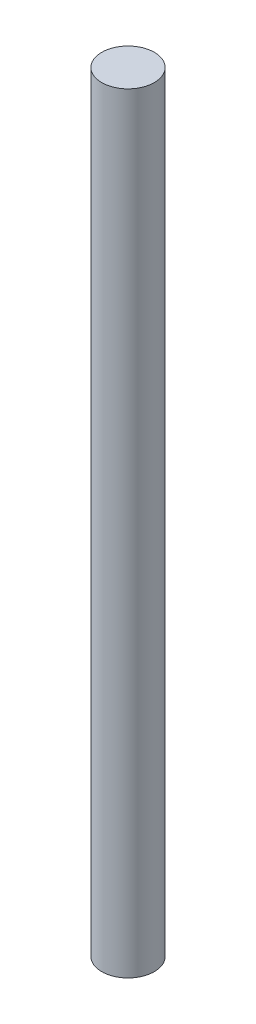
ISO-10303-21;
HEADER;
FILE_DESCRIPTION(('STEP AP214'),'2;1');
FILE_NAME('part.step','',(''),(''),'','','');
FILE_SCHEMA(('AUTOMOTIVE_DESIGN { 1 0 10303 214 1 1 1 1 }'));
ENDSEC;
DATA;
#1=APPLICATION_CONTEXT('core data for automotive mechanical design processes');
#2=APPLICATION_PROTOCOL_DEFINITION('international standard','automotive_design',2000,#1);
#3=PRODUCT_CONTEXT('',#1,'mechanical');
#4=PRODUCT('Part','Part','',(#3));
#5=PRODUCT_RELATED_PRODUCT_CATEGORY('part','',(#4));
#6=PRODUCT_DEFINITION_FORMATION('','',#4);
#7=PRODUCT_DEFINITION_CONTEXT('part definition',#1,'design');
#8=PRODUCT_DEFINITION('design','',#6,#7);
#9=PRODUCT_DEFINITION_SHAPE('','',#8);
#10=(LENGTH_UNIT() NAMED_UNIT(*) SI_UNIT(.MILLI.,.METRE.));
#11=(NAMED_UNIT(*) PLANE_ANGLE_UNIT() SI_UNIT($,.RADIAN.));
#12=(NAMED_UNIT(*) SI_UNIT($,.STERADIAN.) SOLID_ANGLE_UNIT());
#13=UNCERTAINTY_MEASURE_WITH_UNIT(LENGTH_MEASURE(1.E-05),#10,'distance_accuracy_value','');
#14=(GEOMETRIC_REPRESENTATION_CONTEXT(3) GLOBAL_UNCERTAINTY_ASSIGNED_CONTEXT((#13)) GLOBAL_UNIT_ASSIGNED_CONTEXT((#10,
#11,#12)) REPRESENTATION_CONTEXT('',''));
#15=CARTESIAN_POINT('',(0.,0.,0.));
#16=DIRECTION('',(0.,0.,1.));
#17=DIRECTION('',(1.,0.,0.));
#18=AXIS2_PLACEMENT_3D('',#15,#16,#17);
#19=CARTESIAN_POINT('',(0.,38.1,0.));
#20=DIRECTION('',(0.,-1.,0.));
#21=DIRECTION('',(0.,0.,-1.));
#22=AXIS2_PLACEMENT_3D('',#19,#20,#21);
#23=CYLINDRICAL_SURFACE('',#22,1.3);
#24=CARTESIAN_POINT('',(0.,38.1,0.));
#25=DIRECTION('',(0.,1.,0.));
#26=DIRECTION('',(0.,0.,1.));
#27=AXIS2_PLACEMENT_3D('',#24,#25,#26);
#28=CIRCLE('',#27,1.3);
#29=CARTESIAN_POINT('',(0.,38.1,-1.3));
#30=VERTEX_POINT('',#29);
#31=EDGE_CURVE('E10',#30,#30,#28,.T.);
#32=CARTESIAN_POINT('',(0.,0.,0.));
#33=DIRECTION('',(0.,1.,0.));
#34=DIRECTION('',(0.,0.,1.));
#35=AXIS2_PLACEMENT_3D('',#32,#33,#34);
#36=CIRCLE('',#35,1.3);
#37=CARTESIAN_POINT('',(0.,0.,-1.3));
#38=VERTEX_POINT('',#37);
#39=EDGE_CURVE('E40',#38,#38,#36,.T.);
#40=CARTESIAN_POINT('',(0.,38.1,-1.3));
#41=CARTESIAN_POINT('',(0.,37.703125,-1.3));
#42=CARTESIAN_POINT('',(0.,37.30625,-1.3));
#43=CARTESIAN_POINT('',(0.,36.5125,-1.3));
#44=CARTESIAN_POINT('',(0.,36.115625,-1.3));
#45=CARTESIAN_POINT('',(0.,35.321875,-1.3));
#46=CARTESIAN_POINT('',(0.,34.925,-1.3));
#47=CARTESIAN_POINT('',(0.,34.13125,-1.3));
#48=CARTESIAN_POINT('',(0.,33.734375,-1.3));
#49=CARTESIAN_POINT('',(0.,32.940625,-1.3));
#50=CARTESIAN_POINT('',(0.,32.54375,-1.3));
#51=CARTESIAN_POINT('',(0.,31.75,-1.3));
#52=CARTESIAN_POINT('',(0.,31.353125,-1.3));
#53=CARTESIAN_POINT('',(0.,30.559375,-1.3));
#54=CARTESIAN_POINT('',(0.,30.1625,-1.3));
#55=CARTESIAN_POINT('',(0.,29.36875,-1.3));
#56=CARTESIAN_POINT('',(0.,28.971875,-1.3));
#57=CARTESIAN_POINT('',(0.,28.178125,-1.3));
#58=CARTESIAN_POINT('',(0.,27.78125,-1.3));
#59=CARTESIAN_POINT('',(0.,26.9875,-1.3));
#60=CARTESIAN_POINT('',(0.,26.590625,-1.3));
#61=CARTESIAN_POINT('',(0.,25.796875,-1.3));
#62=CARTESIAN_POINT('',(0.,25.4,-1.3));
#63=CARTESIAN_POINT('',(0.,24.60625,-1.3));
#64=CARTESIAN_POINT('',(0.,24.209375,-1.3));
#65=CARTESIAN_POINT('',(0.,23.415625,-1.3));
#66=CARTESIAN_POINT('',(0.,23.01875,-1.3));
#67=CARTESIAN_POINT('',(0.,22.225,-1.3));
#68=CARTESIAN_POINT('',(0.,21.828125,-1.3));
#69=CARTESIAN_POINT('',(0.,21.034375,-1.3));
#70=CARTESIAN_POINT('',(0.,20.6375,-1.3));
#71=CARTESIAN_POINT('',(0.,19.84375,-1.3));
#72=CARTESIAN_POINT('',(0.,19.446875,-1.3));
#73=CARTESIAN_POINT('',(0.,18.653125,-1.3));
#74=CARTESIAN_POINT('',(0.,18.25625,-1.3));
#75=CARTESIAN_POINT('',(0.,17.4625,-1.3));
#76=CARTESIAN_POINT('',(0.,17.065625,-1.3));
#77=CARTESIAN_POINT('',(0.,16.271875,-1.3));
#78=CARTESIAN_POINT('',(0.,15.875,-1.3));
#79=CARTESIAN_POINT('',(0.,15.08125,-1.3));
#80=CARTESIAN_POINT('',(0.,14.684375,-1.3));
#81=CARTESIAN_POINT('',(0.,13.890625,-1.3));
#82=CARTESIAN_POINT('',(0.,13.49375,-1.3));
#83=CARTESIAN_POINT('',(0.,12.7,-1.3));
#84=CARTESIAN_POINT('',(0.,12.303125,-1.3));
#85=CARTESIAN_POINT('',(0.,11.509375,-1.3));
#86=CARTESIAN_POINT('',(0.,11.1125,-1.3));
#87=CARTESIAN_POINT('',(0.,10.31875,-1.3));
#88=CARTESIAN_POINT('',(0.,9.92187499999999,-1.3));
#89=CARTESIAN_POINT('',(0.,9.128125,-1.3));
#90=CARTESIAN_POINT('',(0.,8.73124999999999,-1.3));
#91=CARTESIAN_POINT('',(0.,7.93749999999999,-1.3));
#92=CARTESIAN_POINT('',(0.,7.54062499999999,-1.3));
#93=CARTESIAN_POINT('',(0.,6.746875,-1.3));
#94=CARTESIAN_POINT('',(0.,6.35,-1.3));
#95=CARTESIAN_POINT('',(0.,5.55625,-1.3));
#96=CARTESIAN_POINT('',(0.,5.159375,-1.3));
#97=CARTESIAN_POINT('',(0.,4.365625,-1.3));
#98=CARTESIAN_POINT('',(0.,3.96875,-1.3));
#99=CARTESIAN_POINT('',(0.,3.175,-1.3));
#100=CARTESIAN_POINT('',(0.,2.778125,-1.3));
#101=CARTESIAN_POINT('',(0.,1.984375,-1.3));
#102=CARTESIAN_POINT('',(0.,1.5875,-1.3));
#103=CARTESIAN_POINT('',(0.,0.79375,-1.3));
#104=CARTESIAN_POINT('',(0.,0.396875,-1.3));
#105=CARTESIAN_POINT('',(0.,0.,-1.3));
#106=B_SPLINE_CURVE_WITH_KNOTS('',3,(#40,#41,#42,#43,#44,#45,#46,#47,#48,#49,#50,#51,#52,#53,
#54,#55,#56,#57,#58,#59,#60,#61,#62,#63,#64,#65,#66,#67,#68,#69,#70,#71,#72,#73,#74,#75,#76,#77,
#78,#79,#80,#81,#82,#83,#84,#85,#86,#87,#88,#89,#90,#91,#92,#93,#94,#95,#96,#97,#98,#99,#100,
#101,#102,#103,#104,#105),.UNSPECIFIED.,.F.,.F.,(4,2,2,2,2,2,2,2,2,2,2,2,2,2,2,2,2,2,2,2,2,2,2,
2,2,2,2,2,2,2,2,2,4),(0.,1.190625,2.38125,3.571875,4.7625,5.953125,7.14375,8.334375,
9.52500000000001,10.715625,11.90625,13.096875,14.2875,15.478125,16.66875,17.859375,19.05,
20.240625,21.43125,22.621875,23.8125,25.003125,26.19375,27.384375,28.575,29.765625,30.95625,
32.146875,33.3375,34.528125,35.71875,36.909375,38.1),.UNSPECIFIED.);
#107=EDGE_CURVE('BSEAM37',#30,#38,#106,.T.);
#108=ORIENTED_EDGE('',*,*,#31,.F.);
#109=ORIENTED_EDGE('',*,*,#39,.T.);
#110=ORIENTED_EDGE('',*,*,#107,.T.);
#111=ORIENTED_EDGE('',*,*,#107,.F.);
#112=EDGE_LOOP('',(#108,#110,#109,#111));
#113=FACE_BOUND('',#112,.T.);
#114=ADVANCED_FACE('F37',(#113),#23,.T.);
#115=CARTESIAN_POINT('',(0.,38.1,0.));
#116=DIRECTION('',(0.,1.,0.));
#117=DIRECTION('',(0.,0.,1.));
#118=AXIS2_PLACEMENT_3D('',#115,#116,#117);
#119=PLANE('',#118);
#120=ORIENTED_EDGE('',*,*,#31,.T.);
#121=EDGE_LOOP('',(#120));
#122=FACE_BOUND('',#121,.T.);
#123=ADVANCED_FACE('F54',(#122),#119,.T.);
#124=CARTESIAN_POINT('',(0.,0.,0.));
#125=DIRECTION('',(0.,1.,0.));
#126=DIRECTION('',(0.,0.,1.));
#127=AXIS2_PLACEMENT_3D('',#124,#125,#126);
#128=PLANE('',#127);
#129=ORIENTED_EDGE('',*,*,#39,.F.);
#130=EDGE_LOOP('',(#129));
#131=FACE_BOUND('',#130,.T.);
#132=ADVANCED_FACE('F52',(#131),#128,.F.);
#133=CLOSED_SHELL('',(#114,#123,#132));
#134=MANIFOLD_SOLID_BREP('B2',#133);
#135=ADVANCED_BREP_SHAPE_REPRESENTATION('',(#18,#134),#14);
#136=SHAPE_DEFINITION_REPRESENTATION(#9,#135);
ENDSEC;
END-ISO-10303-21;
